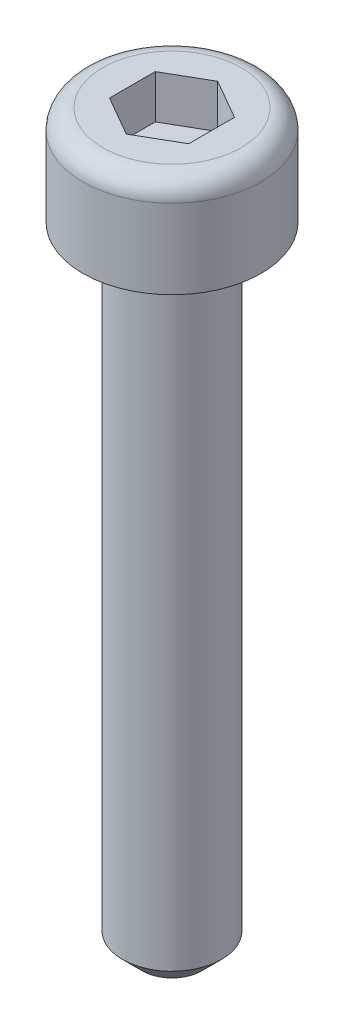
ISO-10303-21;
HEADER;
FILE_DESCRIPTION(('STEP AP214'),'2;1');
FILE_NAME('part.step','',(''),(''),'','','');
FILE_SCHEMA(('AUTOMOTIVE_DESIGN { 1 0 10303 214 1 1 1 1 }'));
ENDSEC;
DATA;
#1=APPLICATION_CONTEXT('core data for automotive mechanical design processes');
#2=APPLICATION_PROTOCOL_DEFINITION('international standard','automotive_design',2000,#1);
#3=PRODUCT_CONTEXT('',#1,'mechanical');
#4=PRODUCT('Part','Part','',(#3));
#5=PRODUCT_RELATED_PRODUCT_CATEGORY('part','',(#4));
#6=PRODUCT_DEFINITION_FORMATION('','',#4);
#7=PRODUCT_DEFINITION_CONTEXT('part definition',#1,'design');
#8=PRODUCT_DEFINITION('design','',#6,#7);
#9=PRODUCT_DEFINITION_SHAPE('','',#8);
#10=(LENGTH_UNIT() NAMED_UNIT(*) SI_UNIT(.MILLI.,.METRE.));
#11=(NAMED_UNIT(*) PLANE_ANGLE_UNIT() SI_UNIT($,.RADIAN.));
#12=(NAMED_UNIT(*) SI_UNIT($,.STERADIAN.) SOLID_ANGLE_UNIT());
#13=UNCERTAINTY_MEASURE_WITH_UNIT(LENGTH_MEASURE(1.E-05),#10,'distance_accuracy_value','');
#14=(GEOMETRIC_REPRESENTATION_CONTEXT(3) GLOBAL_UNCERTAINTY_ASSIGNED_CONTEXT((#13)) GLOBAL_UNIT_ASSIGNED_CONTEXT((#10,
#11,#12)) REPRESENTATION_CONTEXT('',''));
#15=CARTESIAN_POINT('',(0.,0.,0.));
#16=DIRECTION('',(0.,0.,1.));
#17=DIRECTION('',(1.,0.,0.));
#18=AXIS2_PLACEMENT_3D('',#15,#16,#17);
#19=CARTESIAN_POINT('',(0.,0.,0.));
#20=DIRECTION('',(0.,-1.,0.));
#21=DIRECTION('',(0.,0.,-1.));
#22=AXIS2_PLACEMENT_3D('',#19,#20,#21);
#23=PLANE('',#22);
#24=CARTESIAN_POINT('',(0.,0.,0.));
#25=DIRECTION('',(0.,-1.,0.));
#26=DIRECTION('',(0.,0.,-1.));
#27=AXIS2_PLACEMENT_3D('',#24,#25,#26);
#28=CIRCLE('',#27,1.75);
#29=CARTESIAN_POINT('',(0.,0.,-1.75));
#30=VERTEX_POINT('',#29);
#31=EDGE_CURVE('E42',#30,#30,#28,.F.);
#32=ORIENTED_EDGE('',*,*,#31,.T.);
#33=EDGE_LOOP('',(#32));
#34=FACE_BOUND('',#33,.T.);
#35=DIRECTION('',(-0.866025403784439,0.,-0.5));
#36=VECTOR('',#35,1.);
#37=CARTESIAN_POINT('',(1.,0.,-0.577350269189626));
#38=LINE('',#37,#36);
#39=CARTESIAN_POINT('',(1.,0.,-0.577350269189626));
#40=VERTEX_POINT('',#39);
#41=CARTESIAN_POINT('',(0.,0.,-1.15470053837925));
#42=VERTEX_POINT('',#41);
#43=EDGE_CURVE('E123',#40,#42,#38,.T.);
#44=ORIENTED_EDGE('',*,*,#43,.F.);
#45=DIRECTION('',(0.,0.,-1.));
#46=VECTOR('',#45,1.);
#47=CARTESIAN_POINT('',(1.,0.,0.577350269189626));
#48=LINE('',#47,#46);
#49=CARTESIAN_POINT('',(1.,0.,0.577350269189626));
#50=VERTEX_POINT('',#49);
#51=EDGE_CURVE('E49',#50,#40,#48,.T.);
#52=ORIENTED_EDGE('',*,*,#51,.F.);
#53=DIRECTION('',(0.866025403784439,0.,-0.5));
#54=VECTOR('',#53,1.);
#55=CARTESIAN_POINT('',(0.,0.,1.15470053837925));
#56=LINE('',#55,#54);
#57=CARTESIAN_POINT('',(0.,0.,1.15470053837925));
#58=VERTEX_POINT('',#57);
#59=EDGE_CURVE('E132',#58,#50,#56,.T.);
#60=ORIENTED_EDGE('',*,*,#59,.F.);
#61=DIRECTION('',(0.866025403784438,0.,0.5));
#62=VECTOR('',#61,1.);
#63=CARTESIAN_POINT('',(-0.999999999999999,0.,0.577350269189626));
#64=LINE('',#63,#62);
#65=CARTESIAN_POINT('',(-0.999999999999999,0.,0.577350269189626));
#66=VERTEX_POINT('',#65);
#67=EDGE_CURVE('E130',#66,#58,#64,.T.);
#68=ORIENTED_EDGE('',*,*,#67,.F.);
#69=DIRECTION('',(0.,0.,1.));
#70=VECTOR('',#69,1.);
#71=CARTESIAN_POINT('',(-0.999999999999999,0.,-0.577350269189626));
#72=LINE('',#71,#70);
#73=CARTESIAN_POINT('',(-0.999999999999999,0.,-0.577350269189626));
#74=VERTEX_POINT('',#73);
#75=EDGE_CURVE('E97',#74,#66,#72,.T.);
#76=ORIENTED_EDGE('',*,*,#75,.F.);
#77=DIRECTION('',(-0.866025403784439,0.,0.5));
#78=VECTOR('',#77,1.);
#79=CARTESIAN_POINT('',(0.,0.,-1.15470053837925));
#80=LINE('',#79,#78);
#81=EDGE_CURVE('E126',#42,#74,#80,.T.);
#82=ORIENTED_EDGE('',*,*,#81,.F.);
#83=EDGE_LOOP('',(#44,#52,#60,#68,#76,#82));
#84=FACE_BOUND('',#83,.T.);
#85=ADVANCED_FACE('F34',(#34,#84),#23,.F.);
#86=CARTESIAN_POINT('',(0.,0.,0.));
#87=DIRECTION('',(0.,1.,0.));
#88=DIRECTION('',(0.,0.,1.));
#89=AXIS2_PLACEMENT_3D('',#86,#87,#88);
#90=CYLINDRICAL_SURFACE('',#89,2.25);
#91=CARTESIAN_POINT('',(0.,-0.5,0.));
#92=DIRECTION('',(0.,-1.,0.));
#93=DIRECTION('',(0.,0.,-1.));
#94=AXIS2_PLACEMENT_3D('',#91,#92,#93);
#95=CIRCLE('',#94,2.25);
#96=CARTESIAN_POINT('',(0.,-0.5,-2.25));
#97=VERTEX_POINT('',#96);
#98=EDGE_CURVE('E11',#97,#97,#95,.T.);
#99=ORIENTED_EDGE('',*,*,#98,.T.);
#100=EDGE_LOOP('',(#99));
#101=FACE_BOUND('',#100,.T.);
#102=CARTESIAN_POINT('',(0.,-2.5,0.));
#103=DIRECTION('',(0.,1.,0.));
#104=DIRECTION('',(0.,0.,1.));
#105=AXIS2_PLACEMENT_3D('',#102,#103,#104);
#106=CIRCLE('',#105,2.25);
#107=CARTESIAN_POINT('',(0.,-2.5,2.25));
#108=VERTEX_POINT('',#107);
#109=EDGE_CURVE('E144',#108,#108,#106,.T.);
#110=ORIENTED_EDGE('',*,*,#109,.T.);
#111=EDGE_LOOP('',(#110));
#112=FACE_BOUND('',#111,.T.);
#113=ADVANCED_FACE('F166',(#101,#112),#90,.T.);
#114=CARTESIAN_POINT('',(2.25,-2.5,0.));
#115=DIRECTION('',(0.,1.,0.));
#116=DIRECTION('',(0.,0.,1.));
#117=AXIS2_PLACEMENT_3D('',#114,#115,#116);
#118=PLANE('',#117);
#119=ORIENTED_EDGE('',*,*,#109,.F.);
#120=EDGE_LOOP('',(#119));
#121=FACE_BOUND('',#120,.T.);
#122=CARTESIAN_POINT('',(0.,-2.5,0.));
#123=DIRECTION('',(0.,1.,0.));
#124=DIRECTION('',(0.,0.,1.));
#125=AXIS2_PLACEMENT_3D('',#122,#123,#124);
#126=CIRCLE('',#125,1.25);
#127=CARTESIAN_POINT('',(0.,-2.5,1.25));
#128=VERTEX_POINT('',#127);
#129=EDGE_CURVE('E136',#128,#128,#126,.T.);
#130=ORIENTED_EDGE('',*,*,#129,.T.);
#131=EDGE_LOOP('',(#130));
#132=FACE_BOUND('',#131,.T.);
#133=ADVANCED_FACE('F171',(#121,#132),#118,.F.);
#134=CARTESIAN_POINT('',(0.,0.,0.));
#135=DIRECTION('',(0.,1.,0.));
#136=DIRECTION('',(0.,0.,1.));
#137=AXIS2_PLACEMENT_3D('',#134,#135,#136);
#138=CYLINDRICAL_SURFACE('',#137,1.25);
#139=CARTESIAN_POINT('',(0.,-18.,0.));
#140=DIRECTION('',(0.,1.,0.));
#141=DIRECTION('',(0.,0.,1.));
#142=AXIS2_PLACEMENT_3D('',#139,#140,#141);
#143=CIRCLE('',#142,1.25);
#144=CARTESIAN_POINT('',(0.,-18.,1.25));
#145=VERTEX_POINT('',#144);
#146=EDGE_CURVE('E147',#145,#145,#143,.T.);
#147=ORIENTED_EDGE('',*,*,#146,.T.);
#148=EDGE_LOOP('',(#147));
#149=FACE_BOUND('',#148,.T.);
#150=ORIENTED_EDGE('',*,*,#129,.F.);
#151=EDGE_LOOP('',(#150));
#152=FACE_BOUND('',#151,.T.);
#153=ADVANCED_FACE('F177',(#149,#152),#138,.T.);
#154=CARTESIAN_POINT('',(1.25,-18.5,0.));
#155=DIRECTION('',(0.,1.,0.));
#156=DIRECTION('',(0.,0.,1.));
#157=AXIS2_PLACEMENT_3D('',#154,#155,#156);
#158=PLANE('',#157);
#159=CARTESIAN_POINT('',(0.,-18.5,0.));
#160=DIRECTION('',(0.,1.,0.));
#161=DIRECTION('',(0.,0.,1.));
#162=AXIS2_PLACEMENT_3D('',#159,#160,#161);
#163=CIRCLE('',#162,0.749999999999999);
#164=CARTESIAN_POINT('',(0.,-18.5,0.749999999999999));
#165=VERTEX_POINT('',#164);
#166=EDGE_CURVE('E150',#165,#165,#163,.F.);
#167=ORIENTED_EDGE('',*,*,#166,.T.);
#168=EDGE_LOOP('',(#167));
#169=FACE_BOUND('',#168,.T.);
#170=ADVANCED_FACE('F181',(#169),#158,.F.);
#171=CARTESIAN_POINT('',(1.,-1.1,0.577350269189626));
#172=DIRECTION('',(1.,0.,0.));
#173=DIRECTION('',(0.,0.,-1.));
#174=AXIS2_PLACEMENT_3D('',#171,#172,#173);
#175=PLANE('',#174);
#176=ORIENTED_EDGE('',*,*,#51,.T.);
#177=DIRECTION('',(0.,1.,0.));
#178=VECTOR('',#177,1.);
#179=CARTESIAN_POINT('',(1.,-1.1,-0.577350269189626));
#180=LINE('',#179,#178);
#181=CARTESIAN_POINT('',(1.,-1.1,-0.577350269189626));
#182=VERTEX_POINT('',#181);
#183=EDGE_CURVE('E79',#182,#40,#180,.T.);
#184=ORIENTED_EDGE('',*,*,#183,.F.);
#185=DIRECTION('',(0.,0.,-1.));
#186=VECTOR('',#185,1.);
#187=CARTESIAN_POINT('',(1.,-1.1,0.577350269189626));
#188=LINE('',#187,#186);
#189=CARTESIAN_POINT('',(1.,-1.1,0.577350269189626));
#190=VERTEX_POINT('',#189);
#191=EDGE_CURVE('E134',#190,#182,#188,.T.);
#192=ORIENTED_EDGE('',*,*,#191,.F.);
#193=DIRECTION('',(0.,1.,0.));
#194=VECTOR('',#193,1.);
#195=CARTESIAN_POINT('',(1.,-1.1,0.577350269189626));
#196=LINE('',#195,#194);
#197=EDGE_CURVE('E57',#190,#50,#196,.T.);
#198=ORIENTED_EDGE('',*,*,#197,.T.);
#199=EDGE_LOOP('',(#176,#184,#192,#198));
#200=FACE_BOUND('',#199,.T.);
#201=ADVANCED_FACE('F185',(#200),#175,.F.);
#202=CARTESIAN_POINT('',(0.,-1.1,1.15470053837925));
#203=DIRECTION('',(0.5,0.,0.866025403784439));
#204=DIRECTION('',(0.866025403784439,0.,-0.5));
#205=AXIS2_PLACEMENT_3D('',#202,#203,#204);
#206=PLANE('',#205);
#207=ORIENTED_EDGE('',*,*,#59,.T.);
#208=ORIENTED_EDGE('',*,*,#197,.F.);
#209=DIRECTION('',(0.866025403784439,0.,-0.5));
#210=VECTOR('',#209,1.);
#211=CARTESIAN_POINT('',(0.,-1.1,1.15470053837925));
#212=LINE('',#211,#210);
#213=CARTESIAN_POINT('',(0.,-1.1,1.15470053837925));
#214=VERTEX_POINT('',#213);
#215=EDGE_CURVE('E109',#214,#190,#212,.T.);
#216=ORIENTED_EDGE('',*,*,#215,.F.);
#217=DIRECTION('',(0.,1.,0.));
#218=VECTOR('',#217,1.);
#219=CARTESIAN_POINT('',(0.,-1.1,1.15470053837925));
#220=LINE('',#219,#218);
#221=EDGE_CURVE('E101',#214,#58,#220,.T.);
#222=ORIENTED_EDGE('',*,*,#221,.T.);
#223=EDGE_LOOP('',(#207,#208,#216,#222));
#224=FACE_BOUND('',#223,.T.);
#225=ADVANCED_FACE('F189',(#224),#206,.F.);
#226=CARTESIAN_POINT('',(-0.999999999999999,-1.1,0.577350269189626));
#227=DIRECTION('',(-0.5,0.,0.866025403784439));
#228=DIRECTION('',(0.866025403784438,0.,0.5));
#229=AXIS2_PLACEMENT_3D('',#226,#227,#228);
#230=PLANE('',#229);
#231=ORIENTED_EDGE('',*,*,#67,.T.);
#232=ORIENTED_EDGE('',*,*,#221,.F.);
#233=DIRECTION('',(0.866025403784438,0.,0.5));
#234=VECTOR('',#233,1.);
#235=CARTESIAN_POINT('',(-0.999999999999999,-1.1,0.577350269189626));
#236=LINE('',#235,#234);
#237=CARTESIAN_POINT('',(-0.999999999999999,-1.1,0.577350269189626));
#238=VERTEX_POINT('',#237);
#239=EDGE_CURVE('E105',#238,#214,#236,.T.);
#240=ORIENTED_EDGE('',*,*,#239,.F.);
#241=DIRECTION('',(0.,1.,0.));
#242=VECTOR('',#241,1.);
#243=CARTESIAN_POINT('',(-0.999999999999999,-1.1,0.577350269189626));
#244=LINE('',#243,#242);
#245=EDGE_CURVE('E90',#238,#66,#244,.T.);
#246=ORIENTED_EDGE('',*,*,#245,.T.);
#247=EDGE_LOOP('',(#231,#232,#240,#246));
#248=FACE_BOUND('',#247,.T.);
#249=ADVANCED_FACE('F106',(#248),#230,.F.);
#250=CARTESIAN_POINT('',(-0.999999999999999,-1.1,-0.577350269189626));
#251=DIRECTION('',(-1.,0.,0.));
#252=DIRECTION('',(0.,0.,1.));
#253=AXIS2_PLACEMENT_3D('',#250,#251,#252);
#254=PLANE('',#253);
#255=ORIENTED_EDGE('',*,*,#75,.T.);
#256=ORIENTED_EDGE('',*,*,#245,.F.);
#257=DIRECTION('',(0.,0.,1.));
#258=VECTOR('',#257,1.);
#259=CARTESIAN_POINT('',(-0.999999999999999,-1.1,-0.577350269189626));
#260=LINE('',#259,#258);
#261=CARTESIAN_POINT('',(-0.999999999999999,-1.1,-0.577350269189626));
#262=VERTEX_POINT('',#261);
#263=EDGE_CURVE('E94',#262,#238,#260,.T.);
#264=ORIENTED_EDGE('',*,*,#263,.F.);
#265=DIRECTION('',(0.,1.,0.));
#266=VECTOR('',#265,1.);
#267=CARTESIAN_POINT('',(-0.999999999999999,-1.1,-0.577350269189626));
#268=LINE('',#267,#266);
#269=EDGE_CURVE('E102',#262,#74,#268,.T.);
#270=ORIENTED_EDGE('',*,*,#269,.T.);
#271=EDGE_LOOP('',(#255,#256,#264,#270));
#272=FACE_BOUND('',#271,.T.);
#273=ADVANCED_FACE('F92',(#272),#254,.F.);
#274=CARTESIAN_POINT('',(0.,-1.1,-1.15470053837925));
#275=DIRECTION('',(-0.5,0.,-0.866025403784439));
#276=DIRECTION('',(-0.866025403784439,0.,0.5));
#277=AXIS2_PLACEMENT_3D('',#274,#275,#276);
#278=PLANE('',#277);
#279=ORIENTED_EDGE('',*,*,#81,.T.);
#280=ORIENTED_EDGE('',*,*,#269,.F.);
#281=DIRECTION('',(-0.866025403784439,0.,0.5));
#282=VECTOR('',#281,1.);
#283=CARTESIAN_POINT('',(0.,-1.1,-1.15470053837925));
#284=LINE('',#283,#282);
#285=CARTESIAN_POINT('',(0.,-1.1,-1.15470053837925));
#286=VERTEX_POINT('',#285);
#287=EDGE_CURVE('E115',#286,#262,#284,.T.);
#288=ORIENTED_EDGE('',*,*,#287,.F.);
#289=DIRECTION('',(0.,1.,0.));
#290=VECTOR('',#289,1.);
#291=CARTESIAN_POINT('',(0.,-1.1,-1.15470053837925));
#292=LINE('',#291,#290);
#293=EDGE_CURVE('E139',#286,#42,#292,.T.);
#294=ORIENTED_EDGE('',*,*,#293,.T.);
#295=EDGE_LOOP('',(#279,#280,#288,#294));
#296=FACE_BOUND('',#295,.T.);
#297=ADVANCED_FACE('F193',(#296),#278,.F.);
#298=CARTESIAN_POINT('',(1.,-1.1,-0.577350269189626));
#299=DIRECTION('',(0.5,0.,-0.866025403784438));
#300=DIRECTION('',(-0.866025403784438,0.,-0.5));
#301=AXIS2_PLACEMENT_3D('',#298,#299,#300);
#302=PLANE('',#301);
#303=ORIENTED_EDGE('',*,*,#43,.T.);
#304=ORIENTED_EDGE('',*,*,#293,.F.);
#305=DIRECTION('',(-0.866025403784439,0.,-0.5));
#306=VECTOR('',#305,1.);
#307=CARTESIAN_POINT('',(1.,-1.1,-0.577350269189626));
#308=LINE('',#307,#306);
#309=EDGE_CURVE('E117',#182,#286,#308,.T.);
#310=ORIENTED_EDGE('',*,*,#309,.F.);
#311=ORIENTED_EDGE('',*,*,#183,.T.);
#312=EDGE_LOOP('',(#303,#304,#310,#311));
#313=FACE_BOUND('',#312,.T.);
#314=ADVANCED_FACE('F190',(#313),#302,.F.);
#315=CARTESIAN_POINT('',(1.,-1.1,-0.577350269189626));
#316=DIRECTION('',(0.,1.,0.));
#317=DIRECTION('',(0.,0.,1.));
#318=AXIS2_PLACEMENT_3D('',#315,#316,#317);
#319=PLANE('',#318);
#320=ORIENTED_EDGE('',*,*,#191,.T.);
#321=ORIENTED_EDGE('',*,*,#309,.T.);
#322=ORIENTED_EDGE('',*,*,#287,.T.);
#323=ORIENTED_EDGE('',*,*,#263,.T.);
#324=ORIENTED_EDGE('',*,*,#239,.T.);
#325=ORIENTED_EDGE('',*,*,#215,.T.);
#326=EDGE_LOOP('',(#320,#321,#322,#323,#324,#325));
#327=FACE_BOUND('',#326,.T.);
#328=ADVANCED_FACE('F112',(#327),#319,.T.);
#329=CARTESIAN_POINT('',(0.,-18.,0.));
#330=DIRECTION('',(0.,1.,0.));
#331=DIRECTION('',(0.,0.,1.));
#332=AXIS2_PLACEMENT_3D('',#329,#330,#331);
#333=CONICAL_SURFACE('',#332,1.25,0.785398163397453);
#334=ORIENTED_EDGE('',*,*,#166,.F.);
#335=EDGE_LOOP('',(#334));
#336=FACE_BOUND('',#335,.T.);
#337=ORIENTED_EDGE('',*,*,#146,.F.);
#338=EDGE_LOOP('',(#337));
#339=FACE_BOUND('',#338,.T.);
#340=ADVANCED_FACE('F158',(#336,#339),#333,.T.);
#341=CARTESIAN_POINT('',(0.,-0.5,0.));
#342=DIRECTION('',(0.,-1.,0.));
#343=DIRECTION('',(0.,0.,-1.));
#344=AXIS2_PLACEMENT_3D('',#341,#342,#343);
#345=TOROIDAL_SURFACE('',#344,1.75,0.5);
#346=ORIENTED_EDGE('',*,*,#98,.F.);
#347=EDGE_LOOP('',(#346));
#348=FACE_BOUND('',#347,.T.);
#349=ORIENTED_EDGE('',*,*,#31,.F.);
#350=EDGE_LOOP('',(#349));
#351=FACE_BOUND('',#350,.T.);
#352=ADVANCED_FACE('F36',(#348,#351),#345,.T.);
#353=CLOSED_SHELL('',(#85,#113,#133,#153,#170,#201,#225,#249,#273,#297,#314,#328,#340,#352));
#354=MANIFOLD_SOLID_BREP('B2',#353);
#355=ADVANCED_BREP_SHAPE_REPRESENTATION('',(#18,#354),#14);
#356=SHAPE_DEFINITION_REPRESENTATION(#9,#355);
ENDSEC;
END-ISO-10303-21;
